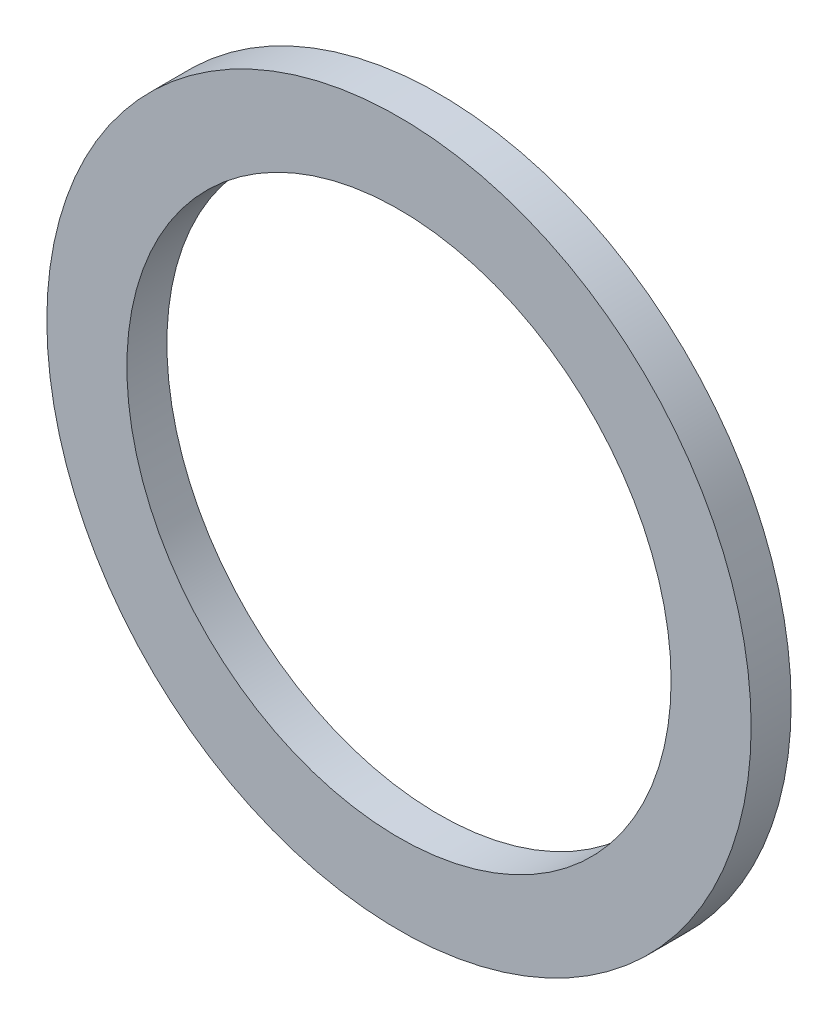
ISO-10303-21;
HEADER;
FILE_DESCRIPTION(('STEP AP214'),'2;1');
FILE_NAME('part.step','',(''),(''),'','','');
FILE_SCHEMA(('AUTOMOTIVE_DESIGN { 1 0 10303 214 1 1 1 1 }'));
ENDSEC;
DATA;
#1=APPLICATION_CONTEXT('core data for automotive mechanical design processes');
#2=APPLICATION_PROTOCOL_DEFINITION('international standard','automotive_design',2000,#1);
#3=PRODUCT_CONTEXT('',#1,'mechanical');
#4=PRODUCT('Part','Part','',(#3));
#5=PRODUCT_RELATED_PRODUCT_CATEGORY('part','',(#4));
#6=PRODUCT_DEFINITION_FORMATION('','',#4);
#7=PRODUCT_DEFINITION_CONTEXT('part definition',#1,'design');
#8=PRODUCT_DEFINITION('design','',#6,#7);
#9=PRODUCT_DEFINITION_SHAPE('','',#8);
#10=(LENGTH_UNIT() NAMED_UNIT(*) SI_UNIT(.MILLI.,.METRE.));
#11=(NAMED_UNIT(*) PLANE_ANGLE_UNIT() SI_UNIT($,.RADIAN.));
#12=(NAMED_UNIT(*) SI_UNIT($,.STERADIAN.) SOLID_ANGLE_UNIT());
#13=UNCERTAINTY_MEASURE_WITH_UNIT(LENGTH_MEASURE(1.E-05),#10,'distance_accuracy_value','');
#14=(GEOMETRIC_REPRESENTATION_CONTEXT(3) GLOBAL_UNCERTAINTY_ASSIGNED_CONTEXT((#13)) GLOBAL_UNIT_ASSIGNED_CONTEXT((#10,
#11,#12)) REPRESENTATION_CONTEXT('',''));
#15=CARTESIAN_POINT('',(0.,0.,0.));
#16=DIRECTION('',(0.,0.,1.));
#17=DIRECTION('',(1.,0.,0.));
#18=AXIS2_PLACEMENT_3D('',#15,#16,#17);
#19=CARTESIAN_POINT('',(0.,0.,12.7));
#20=DIRECTION('',(0.,0.,-1.));
#21=DIRECTION('',(-1.,0.,0.));
#22=AXIS2_PLACEMENT_3D('',#19,#20,#21);
#23=CYLINDRICAL_SURFACE('',#22,86.36);
#24=CARTESIAN_POINT('',(0.,0.,12.7));
#25=DIRECTION('',(0.,0.,1.));
#26=DIRECTION('',(1.,0.,0.));
#27=AXIS2_PLACEMENT_3D('',#24,#25,#26);
#28=CIRCLE('',#27,86.36);
#29=CARTESIAN_POINT('',(86.36,0.,12.7));
#30=VERTEX_POINT('',#29);
#31=EDGE_CURVE('E45',#30,#30,#28,.T.);
#32=ORIENTED_EDGE('',*,*,#31,.T.);
#33=EDGE_LOOP('',(#32));
#34=FACE_BOUND('',#33,.T.);
#35=CARTESIAN_POINT('',(0.,0.,0.));
#36=DIRECTION('',(0.,0.,1.));
#37=DIRECTION('',(1.,0.,0.));
#38=AXIS2_PLACEMENT_3D('',#35,#36,#37);
#39=CIRCLE('',#38,86.36);
#40=CARTESIAN_POINT('',(86.36,0.,0.));
#41=VERTEX_POINT('',#40);
#42=EDGE_CURVE('E52',#41,#41,#39,.T.);
#43=ORIENTED_EDGE('',*,*,#42,.F.);
#44=EDGE_LOOP('',(#43));
#45=FACE_BOUND('',#44,.T.);
#46=ADVANCED_FACE('F37',(#34,#45),#23,.F.);
#47=CARTESIAN_POINT('',(0.,0.,12.7));
#48=DIRECTION('',(0.,0.,-1.));
#49=DIRECTION('',(-1.,0.,0.));
#50=AXIS2_PLACEMENT_3D('',#47,#48,#49);
#51=CYLINDRICAL_SURFACE('',#50,111.76);
#52=CARTESIAN_POINT('',(0.,0.,12.7));
#53=DIRECTION('',(0.,0.,1.));
#54=DIRECTION('',(1.,0.,0.));
#55=AXIS2_PLACEMENT_3D('',#52,#53,#54);
#56=CIRCLE('',#55,111.76);
#57=CARTESIAN_POINT('',(111.76,0.,12.7));
#58=VERTEX_POINT('',#57);
#59=EDGE_CURVE('E10',#58,#58,#56,.T.);
#60=ORIENTED_EDGE('',*,*,#59,.F.);
#61=EDGE_LOOP('',(#60));
#62=FACE_BOUND('',#61,.T.);
#63=CARTESIAN_POINT('',(0.,0.,0.));
#64=DIRECTION('',(0.,0.,1.));
#65=DIRECTION('',(1.,0.,0.));
#66=AXIS2_PLACEMENT_3D('',#63,#64,#65);
#67=CIRCLE('',#66,111.76);
#68=CARTESIAN_POINT('',(111.76,0.,0.));
#69=VERTEX_POINT('',#68);
#70=EDGE_CURVE('E40',#69,#69,#67,.T.);
#71=ORIENTED_EDGE('',*,*,#70,.T.);
#72=EDGE_LOOP('',(#71));
#73=FACE_BOUND('',#72,.T.);
#74=ADVANCED_FACE('F61',(#62,#73),#51,.T.);
#75=CARTESIAN_POINT('',(0.,0.,12.7));
#76=DIRECTION('',(0.,0.,1.));
#77=DIRECTION('',(1.,0.,0.));
#78=AXIS2_PLACEMENT_3D('',#75,#76,#77);
#79=PLANE('',#78);
#80=ORIENTED_EDGE('',*,*,#31,.F.);
#81=EDGE_LOOP('',(#80));
#82=FACE_BOUND('',#81,.T.);
#83=ORIENTED_EDGE('',*,*,#59,.T.);
#84=EDGE_LOOP('',(#83));
#85=FACE_BOUND('',#84,.T.);
#86=ADVANCED_FACE('F65',(#82,#85),#79,.T.);
#87=CARTESIAN_POINT('',(0.,0.,0.));
#88=DIRECTION('',(0.,0.,1.));
#89=DIRECTION('',(1.,0.,0.));
#90=AXIS2_PLACEMENT_3D('',#87,#88,#89);
#91=PLANE('',#90);
#92=ORIENTED_EDGE('',*,*,#42,.T.);
#93=EDGE_LOOP('',(#92));
#94=FACE_BOUND('',#93,.T.);
#95=ORIENTED_EDGE('',*,*,#70,.F.);
#96=EDGE_LOOP('',(#95));
#97=FACE_BOUND('',#96,.T.);
#98=ADVANCED_FACE('F63',(#94,#97),#91,.F.);
#99=CLOSED_SHELL('',(#46,#74,#86,#98));
#100=MANIFOLD_SOLID_BREP('B2',#99);
#101=ADVANCED_BREP_SHAPE_REPRESENTATION('',(#18,#100),#14);
#102=SHAPE_DEFINITION_REPRESENTATION(#9,#101);
ENDSEC;
END-ISO-10303-21;
